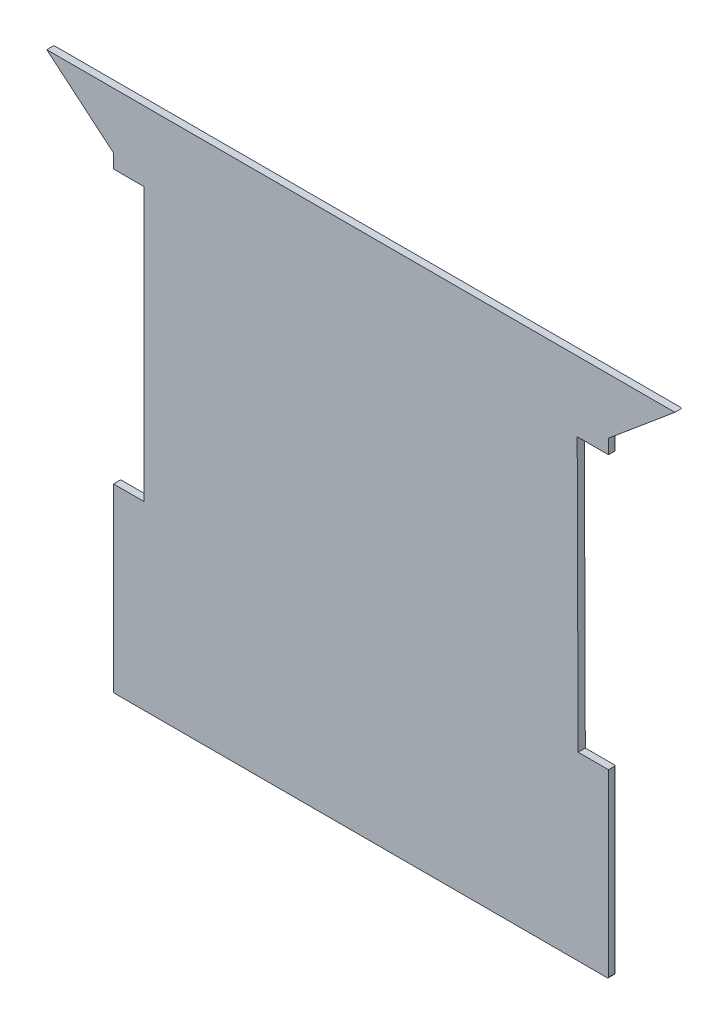
ISO-10303-21;
HEADER;
FILE_DESCRIPTION(('STEP AP214'),'2;1');
FILE_NAME('part.step','',(''),(''),'','','');
FILE_SCHEMA(('AUTOMOTIVE_DESIGN { 1 0 10303 214 1 1 1 1 }'));
ENDSEC;
DATA;
#1=APPLICATION_CONTEXT('core data for automotive mechanical design processes');
#2=APPLICATION_PROTOCOL_DEFINITION('international standard','automotive_design',2000,#1);
#3=PRODUCT_CONTEXT('',#1,'mechanical');
#4=PRODUCT('Part','Part','',(#3));
#5=PRODUCT_RELATED_PRODUCT_CATEGORY('part','',(#4));
#6=PRODUCT_DEFINITION_FORMATION('','',#4);
#7=PRODUCT_DEFINITION_CONTEXT('part definition',#1,'design');
#8=PRODUCT_DEFINITION('design','',#6,#7);
#9=PRODUCT_DEFINITION_SHAPE('','',#8);
#10=(LENGTH_UNIT() NAMED_UNIT(*) SI_UNIT(.MILLI.,.METRE.));
#11=(NAMED_UNIT(*) PLANE_ANGLE_UNIT() SI_UNIT($,.RADIAN.));
#12=(NAMED_UNIT(*) SI_UNIT($,.STERADIAN.) SOLID_ANGLE_UNIT());
#13=UNCERTAINTY_MEASURE_WITH_UNIT(LENGTH_MEASURE(1.E-05),#10,'distance_accuracy_value','');
#14=(GEOMETRIC_REPRESENTATION_CONTEXT(3) GLOBAL_UNCERTAINTY_ASSIGNED_CONTEXT((#13)) GLOBAL_UNIT_ASSIGNED_CONTEXT((#10,
#11,#12)) REPRESENTATION_CONTEXT('',''));
#15=CARTESIAN_POINT('',(0.,0.,0.));
#16=DIRECTION('',(0.,0.,1.));
#17=DIRECTION('',(1.,0.,0.));
#18=AXIS2_PLACEMENT_3D('',#15,#16,#17);
#19=CARTESIAN_POINT('',(326.309589424397,724.438959159954,12.));
#20=DIRECTION('',(0.,1.,0.));
#21=DIRECTION('',(0.,0.,1.));
#22=AXIS2_PLACEMENT_3D('',#19,#20,#21);
#23=PLANE('',#22);
#24=DIRECTION('',(0.,0.,-1.));
#25=VECTOR('',#24,1.);
#26=CARTESIAN_POINT('',(326.309589424397,724.438959159954,12.));
#27=LINE('',#26,#25);
#28=CARTESIAN_POINT('',(326.309589424397,724.438959159954,12.));
#29=VERTEX_POINT('',#28);
#30=CARTESIAN_POINT('',(326.309589424397,724.438959159954,2.));
#31=VERTEX_POINT('',#30);
#32=EDGE_CURVE('E385',#29,#31,#27,.T.);
#33=ORIENTED_EDGE('',*,*,#32,.T.);
#34=CARTESIAN_POINT('',(328.309589424397,724.438959159954,2.));
#35=DIRECTION('',(0.,1.,0.));
#36=DIRECTION('',(0.,0.,1.));
#37=AXIS2_PLACEMENT_3D('',#34,#35,#36);
#38=CIRCLE('',#37,2.);
#39=CARTESIAN_POINT('',(328.309589424397,724.438959159954,0.));
#40=VERTEX_POINT('',#39);
#41=EDGE_CURVE('E268',#31,#40,#38,.F.);
#42=ORIENTED_EDGE('',*,*,#41,.T.);
#43=DIRECTION('',(1.,0.,0.));
#44=VECTOR('',#43,1.);
#45=CARTESIAN_POINT('',(326.309589424397,724.438959159954,0.));
#46=LINE('',#45,#44);
#47=CARTESIAN_POINT('',(377.12760685605,724.438959159954,0.));
#48=VERTEX_POINT('',#47);
#49=EDGE_CURVE('E219',#40,#48,#46,.T.);
#50=ORIENTED_EDGE('',*,*,#49,.T.);
#51=DIRECTION('',(0.,0.,-1.));
#52=VECTOR('',#51,1.);
#53=CARTESIAN_POINT('',(377.12760685605,724.438959159954,12.));
#54=LINE('',#53,#52);
#55=CARTESIAN_POINT('',(377.12760685605,724.438959159954,12.));
#56=VERTEX_POINT('',#55);
#57=EDGE_CURVE('E380',#56,#48,#54,.T.);
#58=ORIENTED_EDGE('',*,*,#57,.F.);
#59=DIRECTION('',(1.,0.,0.));
#60=VECTOR('',#59,1.);
#61=CARTESIAN_POINT('',(326.309589424397,724.438959159954,12.));
#62=LINE('',#61,#60);
#63=EDGE_CURVE('E244',#29,#56,#62,.T.);
#64=ORIENTED_EDGE('',*,*,#63,.F.);
#65=EDGE_LOOP('',(#33,#42,#50,#58,#64));
#66=FACE_BOUND('',#65,.T.);
#67=ADVANCED_FACE('F38',(#66),#23,.F.);
#68=CARTESIAN_POINT('',(377.12760685605,724.438959159954,12.));
#69=DIRECTION('',(1.,0.,0.));
#70=DIRECTION('',(0.,0.,-1.));
#71=AXIS2_PLACEMENT_3D('',#68,#69,#70);
#72=PLANE('',#71);
#73=DIRECTION('',(0.,-1.,0.));
#74=VECTOR('',#73,1.);
#75=CARTESIAN_POINT('',(377.12760685605,724.438959159954,0.));
#76=LINE('',#75,#74);
#77=CARTESIAN_POINT('',(377.12760685605,269.903158483453,0.));
#78=VERTEX_POINT('',#77);
#79=EDGE_CURVE('E217',#48,#78,#76,.T.);
#80=ORIENTED_EDGE('',*,*,#79,.T.);
#81=DIRECTION('',(0.,0.,-1.));
#82=VECTOR('',#81,1.);
#83=CARTESIAN_POINT('',(377.12760685605,269.903158483453,12.));
#84=LINE('',#83,#82);
#85=CARTESIAN_POINT('',(377.12760685605,269.903158483453,12.));
#86=VERTEX_POINT('',#85);
#87=EDGE_CURVE('E376',#86,#78,#84,.T.);
#88=ORIENTED_EDGE('',*,*,#87,.F.);
#89=DIRECTION('',(0.,-1.,0.));
#90=VECTOR('',#89,1.);
#91=CARTESIAN_POINT('',(377.12760685605,724.438959159954,12.));
#92=LINE('',#91,#90);
#93=EDGE_CURVE('E242',#56,#86,#92,.T.);
#94=ORIENTED_EDGE('',*,*,#93,.F.);
#95=ORIENTED_EDGE('',*,*,#57,.T.);
#96=EDGE_LOOP('',(#80,#88,#94,#95));
#97=FACE_BOUND('',#96,.T.);
#98=ADVANCED_FACE('F462',(#97),#72,.F.);
#99=CARTESIAN_POINT('',(377.12760685605,269.903158483453,12.));
#100=DIRECTION('',(0.,-1.,0.));
#101=DIRECTION('',(1.,0.,0.));
#102=AXIS2_PLACEMENT_3D('',#99,#100,#101);
#103=PLANE('',#102);
#104=DIRECTION('',(-1.,0.,0.));
#105=VECTOR('',#104,1.);
#106=CARTESIAN_POINT('',(377.12760685605,269.903158483453,0.));
#107=LINE('',#106,#105);
#108=CARTESIAN_POINT('',(328.309589424397,269.903158483453,0.));
#109=VERTEX_POINT('',#108);
#110=EDGE_CURVE('E214',#78,#109,#107,.T.);
#111=ORIENTED_EDGE('',*,*,#110,.T.);
#112=CARTESIAN_POINT('',(328.309589424397,269.903158483453,2.));
#113=DIRECTION('',(0.,-1.,0.));
#114=DIRECTION('',(1.,0.,0.));
#115=AXIS2_PLACEMENT_3D('',#112,#113,#114);
#116=CIRCLE('',#115,2.);
#117=CARTESIAN_POINT('',(326.309589424397,269.903158483453,2.));
#118=VERTEX_POINT('',#117);
#119=EDGE_CURVE('E309',#109,#118,#116,.F.);
#120=ORIENTED_EDGE('',*,*,#119,.T.);
#121=DIRECTION('',(0.,0.,-1.));
#122=VECTOR('',#121,1.);
#123=CARTESIAN_POINT('',(326.309589424397,269.903158483453,12.));
#124=LINE('',#123,#122);
#125=CARTESIAN_POINT('',(326.309589424397,269.903158483453,12.));
#126=VERTEX_POINT('',#125);
#127=EDGE_CURVE('E379',#126,#118,#124,.T.);
#128=ORIENTED_EDGE('',*,*,#127,.F.);
#129=DIRECTION('',(-1.,0.,0.));
#130=VECTOR('',#129,1.);
#131=CARTESIAN_POINT('',(377.12760685605,269.903158483453,12.));
#132=LINE('',#131,#130);
#133=EDGE_CURVE('E240',#86,#126,#132,.T.);
#134=ORIENTED_EDGE('',*,*,#133,.F.);
#135=ORIENTED_EDGE('',*,*,#87,.T.);
#136=EDGE_LOOP('',(#111,#120,#128,#134,#135));
#137=FACE_BOUND('',#136,.T.);
#138=ADVANCED_FACE('F371',(#137),#103,.F.);
#139=CARTESIAN_POINT('',(326.309589424397,269.903158483453,12.));
#140=DIRECTION('',(1.,0.,0.));
#141=DIRECTION('',(0.,1.,0.));
#142=AXIS2_PLACEMENT_3D('',#139,#140,#141);
#143=PLANE('',#142);
#144=DIRECTION('',(0.,-1.,0.));
#145=VECTOR('',#144,1.);
#146=CARTESIAN_POINT('',(326.309589424397,269.903158483453,2.));
#147=LINE('',#146,#145);
#148=CARTESIAN_POINT('',(326.309589424397,-29.4460095883093,2.));
#149=VERTEX_POINT('',#148);
#150=EDGE_CURVE('E298',#118,#149,#147,.T.);
#151=ORIENTED_EDGE('',*,*,#150,.T.);
#152=DIRECTION('',(0.,0.,-1.));
#153=VECTOR('',#152,1.);
#154=CARTESIAN_POINT('',(326.309589424397,-29.4460095883093,12.));
#155=LINE('',#154,#153);
#156=CARTESIAN_POINT('',(326.309589424397,-29.4460095883093,12.));
#157=VERTEX_POINT('',#156);
#158=EDGE_CURVE('E300',#149,#157,#155,.F.);
#159=ORIENTED_EDGE('',*,*,#158,.T.);
#160=DIRECTION('',(0.,-1.,0.));
#161=VECTOR('',#160,1.);
#162=CARTESIAN_POINT('',(326.309589424397,269.903158483453,12.));
#163=LINE('',#162,#161);
#164=EDGE_CURVE('E237',#126,#157,#163,.T.);
#165=ORIENTED_EDGE('',*,*,#164,.F.);
#166=ORIENTED_EDGE('',*,*,#127,.T.);
#167=EDGE_LOOP('',(#151,#159,#165,#166));
#168=FACE_BOUND('',#167,.T.);
#169=ADVANCED_FACE('F467',(#168),#143,.F.);
#170=CARTESIAN_POINT('',(326.309589424397,-31.4460095883093,12.));
#171=DIRECTION('',(0.,1.,0.));
#172=DIRECTION('',(0.,0.,1.));
#173=AXIS2_PLACEMENT_3D('',#170,#171,#172);
#174=PLANE('',#173);
#175=DIRECTION('',(1.,0.,0.));
#176=VECTOR('',#175,1.);
#177=CARTESIAN_POINT('',(326.309589424397,-31.4460095883093,2.));
#178=LINE('',#177,#176);
#179=CARTESIAN_POINT('',(328.309589424397,-31.4460095883093,2.));
#180=VERTEX_POINT('',#179);
#181=CARTESIAN_POINT('',(1149.3095894244,-31.4460095883093,2.));
#182=VERTEX_POINT('',#181);
#183=EDGE_CURVE('E270',#180,#182,#178,.T.);
#184=ORIENTED_EDGE('',*,*,#183,.T.);
#185=DIRECTION('',(0.,0.,-1.));
#186=VECTOR('',#185,1.);
#187=CARTESIAN_POINT('',(1149.3095894244,-31.4460095883093,12.));
#188=LINE('',#187,#186);
#189=CARTESIAN_POINT('',(1149.3095894244,-31.4460095883093,12.));
#190=VERTEX_POINT('',#189);
#191=EDGE_CURVE('E320',#182,#190,#188,.F.);
#192=ORIENTED_EDGE('',*,*,#191,.T.);
#193=DIRECTION('',(1.,0.,0.));
#194=VECTOR('',#193,1.);
#195=CARTESIAN_POINT('',(326.309589424397,-31.4460095883093,12.));
#196=LINE('',#195,#194);
#197=CARTESIAN_POINT('',(328.309589424397,-31.4460095883093,12.));
#198=VERTEX_POINT('',#197);
#199=EDGE_CURVE('E234',#198,#190,#196,.T.);
#200=ORIENTED_EDGE('',*,*,#199,.F.);
#201=DIRECTION('',(0.,0.,-1.));
#202=VECTOR('',#201,1.);
#203=CARTESIAN_POINT('',(328.309589424397,-31.4460095883093,12.));
#204=LINE('',#203,#202);
#205=EDGE_CURVE('E295',#198,#180,#204,.T.);
#206=ORIENTED_EDGE('',*,*,#205,.T.);
#207=EDGE_LOOP('',(#184,#192,#200,#206));
#208=FACE_BOUND('',#207,.T.);
#209=ADVANCED_FACE('F350',(#208),#174,.F.);
#210=CARTESIAN_POINT('',(1151.3095894244,269.903158483453,12.));
#211=DIRECTION('',(-1.,0.,0.));
#212=DIRECTION('',(0.,0.,1.));
#213=AXIS2_PLACEMENT_3D('',#210,#211,#212);
#214=PLANE('',#213);
#215=DIRECTION('',(0.,1.,0.));
#216=VECTOR('',#215,1.);
#217=CARTESIAN_POINT('',(1151.3095894244,269.903158483453,12.));
#218=LINE('',#217,#216);
#219=CARTESIAN_POINT('',(1151.3095894244,-29.4460095883093,12.));
#220=VERTEX_POINT('',#219);
#221=CARTESIAN_POINT('',(1151.3095894244,269.903158483453,12.));
#222=VERTEX_POINT('',#221);
#223=EDGE_CURVE('E232',#220,#222,#218,.T.);
#224=ORIENTED_EDGE('',*,*,#223,.F.);
#225=DIRECTION('',(0.,0.,-1.));
#226=VECTOR('',#225,1.);
#227=CARTESIAN_POINT('',(1151.3095894244,-29.4460095883093,12.));
#228=LINE('',#227,#226);
#229=CARTESIAN_POINT('',(1151.3095894244,-29.4460095883093,2.));
#230=VERTEX_POINT('',#229);
#231=EDGE_CURVE('E317',#220,#230,#228,.T.);
#232=ORIENTED_EDGE('',*,*,#231,.T.);
#233=DIRECTION('',(0.,1.,0.));
#234=VECTOR('',#233,1.);
#235=CARTESIAN_POINT('',(1151.3095894244,269.903158483453,2.));
#236=LINE('',#235,#234);
#237=CARTESIAN_POINT('',(1151.3095894244,269.903158483453,2.));
#238=VERTEX_POINT('',#237);
#239=EDGE_CURVE('E311',#230,#238,#236,.T.);
#240=ORIENTED_EDGE('',*,*,#239,.T.);
#241=DIRECTION('',(0.,0.,-1.));
#242=VECTOR('',#241,1.);
#243=CARTESIAN_POINT('',(1151.3095894244,269.903158483453,12.));
#244=LINE('',#243,#242);
#245=EDGE_CURVE('E382',#222,#238,#244,.T.);
#246=ORIENTED_EDGE('',*,*,#245,.F.);
#247=EDGE_LOOP('',(#224,#232,#240,#246));
#248=FACE_BOUND('',#247,.T.);
#249=ADVANCED_FACE('F341',(#248),#214,.F.);
#250=CARTESIAN_POINT('',(1151.3095894244,269.903158483453,12.));
#251=DIRECTION('',(0.,-1.,0.));
#252=DIRECTION('',(0.,0.,-1.));
#253=AXIS2_PLACEMENT_3D('',#250,#251,#252);
#254=PLANE('',#253);
#255=ORIENTED_EDGE('',*,*,#245,.T.);
#256=CARTESIAN_POINT('',(1149.3095894244,269.903158483453,2.));
#257=DIRECTION('',(0.,-1.,0.));
#258=DIRECTION('',(0.,0.,-1.));
#259=AXIS2_PLACEMENT_3D('',#256,#257,#258);
#260=CIRCLE('',#259,2.);
#261=CARTESIAN_POINT('',(1149.3095894244,269.903158483453,0.));
#262=VERTEX_POINT('',#261);
#263=EDGE_CURVE('E47',#238,#262,#260,.F.);
#264=ORIENTED_EDGE('',*,*,#263,.T.);
#265=DIRECTION('',(-1.,0.,0.));
#266=VECTOR('',#265,1.);
#267=CARTESIAN_POINT('',(1151.3095894244,269.903158483453,0.));
#268=LINE('',#267,#266);
#269=CARTESIAN_POINT('',(1100.60496026136,269.903158483453,0.));
#270=VERTEX_POINT('',#269);
#271=EDGE_CURVE('E191',#262,#270,#268,.T.);
#272=ORIENTED_EDGE('',*,*,#271,.T.);
#273=DIRECTION('',(0.,0.,-1.));
#274=VECTOR('',#273,1.);
#275=CARTESIAN_POINT('',(1100.60496026136,269.903158483453,12.));
#276=LINE('',#275,#274);
#277=CARTESIAN_POINT('',(1100.60496026136,269.903158483453,12.));
#278=VERTEX_POINT('',#277);
#279=EDGE_CURVE('E189',#278,#270,#276,.T.);
#280=ORIENTED_EDGE('',*,*,#279,.F.);
#281=DIRECTION('',(-1.,0.,0.));
#282=VECTOR('',#281,1.);
#283=CARTESIAN_POINT('',(1151.3095894244,269.903158483453,12.));
#284=LINE('',#283,#282);
#285=EDGE_CURVE('E230',#222,#278,#284,.T.);
#286=ORIENTED_EDGE('',*,*,#285,.F.);
#287=EDGE_LOOP('',(#255,#264,#272,#280,#286));
#288=FACE_BOUND('',#287,.T.);
#289=ADVANCED_FACE('F475',(#288),#254,.F.);
#290=CARTESIAN_POINT('',(1100.60496026136,269.903158483453,12.));
#291=DIRECTION('',(-0.999994410080062,-0.00334362208223662,0.));
#292=DIRECTION('',(0.00334362208223662,-0.999994410080062,0.));
#293=AXIS2_PLACEMENT_3D('',#290,#291,#292);
#294=PLANE('',#293);
#295=DIRECTION('',(-0.00334362208223662,0.999994410080062,0.));
#296=VECTOR('',#295,1.);
#297=CARTESIAN_POINT('',(1100.60496026136,269.903158483453,0.));
#298=LINE('',#297,#296);
#299=CARTESIAN_POINT('',(1099.08515582547,724.438959159954,0.));
#300=VERTEX_POINT('',#299);
#301=EDGE_CURVE('E182',#270,#300,#298,.T.);
#302=ORIENTED_EDGE('',*,*,#301,.T.);
#303=DIRECTION('',(0.,0.,-1.));
#304=VECTOR('',#303,1.);
#305=CARTESIAN_POINT('',(1099.08515582547,724.438959159954,12.));
#306=LINE('',#305,#304);
#307=CARTESIAN_POINT('',(1099.08515582547,724.438959159954,12.));
#308=VERTEX_POINT('',#307);
#309=EDGE_CURVE('E186',#308,#300,#306,.T.);
#310=ORIENTED_EDGE('',*,*,#309,.F.);
#311=DIRECTION('',(-0.00334362208223662,0.999994410080062,0.));
#312=VECTOR('',#311,1.);
#313=CARTESIAN_POINT('',(1100.60496026136,269.903158483453,12.));
#314=LINE('',#313,#312);
#315=EDGE_CURVE('E228',#278,#308,#314,.T.);
#316=ORIENTED_EDGE('',*,*,#315,.F.);
#317=ORIENTED_EDGE('',*,*,#279,.T.);
#318=EDGE_LOOP('',(#302,#310,#316,#317));
#319=FACE_BOUND('',#318,.T.);
#320=ADVANCED_FACE('F184',(#319),#294,.F.);
#321=CARTESIAN_POINT('',(1099.08515582547,724.438959159954,12.));
#322=DIRECTION('',(0.,1.,0.));
#323=DIRECTION('',(0.,0.,1.));
#324=AXIS2_PLACEMENT_3D('',#321,#322,#323);
#325=PLANE('',#324);
#326=DIRECTION('',(1.,0.,0.));
#327=VECTOR('',#326,1.);
#328=CARTESIAN_POINT('',(1099.08515582547,724.438959159954,0.));
#329=LINE('',#328,#327);
#330=CARTESIAN_POINT('',(1149.3095894244,724.438959159954,0.));
#331=VERTEX_POINT('',#330);
#332=EDGE_CURVE('E192',#300,#331,#329,.T.);
#333=ORIENTED_EDGE('',*,*,#332,.T.);
#334=CARTESIAN_POINT('',(1149.3095894244,724.438959159954,2.));
#335=DIRECTION('',(0.,1.,0.));
#336=DIRECTION('',(0.,0.,1.));
#337=AXIS2_PLACEMENT_3D('',#334,#335,#336);
#338=CIRCLE('',#337,2.);
#339=CARTESIAN_POINT('',(1151.3095894244,724.438959159954,2.));
#340=VERTEX_POINT('',#339);
#341=EDGE_CURVE('E290',#331,#340,#338,.F.);
#342=ORIENTED_EDGE('',*,*,#341,.T.);
#343=DIRECTION('',(0.,0.,-1.));
#344=VECTOR('',#343,1.);
#345=CARTESIAN_POINT('',(1151.3095894244,724.438959159954,12.));
#346=LINE('',#345,#344);
#347=CARTESIAN_POINT('',(1151.3095894244,724.438959159954,12.));
#348=VERTEX_POINT('',#347);
#349=EDGE_CURVE('E200',#348,#340,#346,.T.);
#350=ORIENTED_EDGE('',*,*,#349,.F.);
#351=DIRECTION('',(1.,0.,0.));
#352=VECTOR('',#351,1.);
#353=CARTESIAN_POINT('',(1099.08515582547,724.438959159954,12.));
#354=LINE('',#353,#352);
#355=EDGE_CURVE('E199',#308,#348,#354,.T.);
#356=ORIENTED_EDGE('',*,*,#355,.F.);
#357=ORIENTED_EDGE('',*,*,#309,.T.);
#358=EDGE_LOOP('',(#333,#342,#350,#356,#357));
#359=FACE_BOUND('',#358,.T.);
#360=ADVANCED_FACE('F196',(#359),#325,.F.);
#361=CARTESIAN_POINT('',(326.309589424397,747.700936122895,12.));
#362=DIRECTION('',(1.,0.,0.));
#363=DIRECTION('',(0.,0.,-1.));
#364=AXIS2_PLACEMENT_3D('',#361,#362,#363);
#365=PLANE('',#364);
#366=DIRECTION('',(0.,0.,-1.));
#367=VECTOR('',#366,1.);
#368=CARTESIAN_POINT('',(326.309589424397,747.700936122895,12.));
#369=LINE('',#368,#367);
#370=CARTESIAN_POINT('',(326.309589424397,747.700936122895,12.));
#371=VERTEX_POINT('',#370);
#372=CARTESIAN_POINT('',(326.309589424397,747.700936122895,2.));
#373=VERTEX_POINT('',#372);
#374=EDGE_CURVE('E273',#371,#373,#369,.T.);
#375=ORIENTED_EDGE('',*,*,#374,.T.);
#376=DIRECTION('',(0.,-1.,0.));
#377=VECTOR('',#376,1.);
#378=CARTESIAN_POINT('',(326.309589424397,747.700936122895,2.));
#379=LINE('',#378,#377);
#380=EDGE_CURVE('E266',#373,#31,#379,.T.);
#381=ORIENTED_EDGE('',*,*,#380,.T.);
#382=ORIENTED_EDGE('',*,*,#32,.F.);
#383=DIRECTION('',(0.,-1.,0.));
#384=VECTOR('',#383,1.);
#385=CARTESIAN_POINT('',(326.309589424397,747.700936122895,12.));
#386=LINE('',#385,#384);
#387=EDGE_CURVE('E207',#371,#29,#386,.T.);
#388=ORIENTED_EDGE('',*,*,#387,.F.);
#389=EDGE_LOOP('',(#375,#381,#382,#388));
#390=FACE_BOUND('',#389,.T.);
#391=ADVANCED_FACE('F428',(#390),#365,.F.);
#392=CARTESIAN_POINT('',(1151.3095894244,748.491751264202,12.));
#393=DIRECTION('',(-1.,0.,0.));
#394=DIRECTION('',(0.,-1.,0.));
#395=AXIS2_PLACEMENT_3D('',#392,#393,#394);
#396=PLANE('',#395);
#397=ORIENTED_EDGE('',*,*,#349,.T.);
#398=DIRECTION('',(0.,1.,0.));
#399=VECTOR('',#398,1.);
#400=CARTESIAN_POINT('',(1151.3095894244,748.491751264202,2.));
#401=LINE('',#400,#399);
#402=CARTESIAN_POINT('',(1151.3095894244,748.491751264202,2.));
#403=VERTEX_POINT('',#402);
#404=EDGE_CURVE('E286',#340,#403,#401,.T.);
#405=ORIENTED_EDGE('',*,*,#404,.T.);
#406=DIRECTION('',(0.,0.,-1.));
#407=VECTOR('',#406,1.);
#408=CARTESIAN_POINT('',(1151.3095894244,748.491751264202,12.));
#409=LINE('',#408,#407);
#410=CARTESIAN_POINT('',(1151.3095894244,748.491751264202,12.));
#411=VERTEX_POINT('',#410);
#412=EDGE_CURVE('E210',#411,#403,#409,.T.);
#413=ORIENTED_EDGE('',*,*,#412,.F.);
#414=DIRECTION('',(0.,1.,0.));
#415=VECTOR('',#414,1.);
#416=CARTESIAN_POINT('',(1151.3095894244,748.491751264202,12.));
#417=LINE('',#416,#415);
#418=EDGE_CURVE('E225',#348,#411,#417,.T.);
#419=ORIENTED_EDGE('',*,*,#418,.F.);
#420=EDGE_LOOP('',(#397,#405,#413,#419));
#421=FACE_BOUND('',#420,.T.);
#422=ADVANCED_FACE('F434',(#421),#396,.F.);
#423=CARTESIAN_POINT('',(0.,0.,12.));
#424=DIRECTION('',(0.,0.,1.));
#425=DIRECTION('',(1.,0.,0.));
#426=AXIS2_PLACEMENT_3D('',#423,#424,#425);
#427=PLANE('',#426);
#428=ORIENTED_EDGE('',*,*,#199,.T.);
#429=CARTESIAN_POINT('',(1149.3095894244,-29.4460095883093,12.));
#430=DIRECTION('',(0.,0.,1.));
#431=DIRECTION('',(1.,0.,0.));
#432=AXIS2_PLACEMENT_3D('',#429,#430,#431);
#433=CIRCLE('',#432,2.);
#434=EDGE_CURVE('E322',#190,#220,#433,.T.);
#435=ORIENTED_EDGE('',*,*,#434,.T.);
#436=ORIENTED_EDGE('',*,*,#223,.T.);
#437=ORIENTED_EDGE('',*,*,#285,.T.);
#438=ORIENTED_EDGE('',*,*,#315,.T.);
#439=ORIENTED_EDGE('',*,*,#355,.T.);
#440=ORIENTED_EDGE('',*,*,#418,.T.);
#441=DIRECTION('',(0.766948152896775,0.641709070193203,0.));
#442=VECTOR('',#441,1.);
#443=CARTESIAN_POINT('',(1151.3095894244,748.491751264202,12.));
#444=LINE('',#443,#442);
#445=CARTESIAN_POINT('',(1261.9367281695,841.053990411817,12.));
#446=VERTEX_POINT('',#445);
#447=EDGE_CURVE('E222',#411,#446,#444,.T.);
#448=ORIENTED_EDGE('',*,*,#447,.T.);
#449=DIRECTION('',(1.,0.,0.));
#450=VECTOR('',#449,1.);
#451=CARTESIAN_POINT('',(-6.11684115650869E-13,841.053990411816,12.));
#452=LINE('',#451,#450);
#453=CARTESIAN_POINT('',(215.065202413403,841.053990411817,12.));
#454=VERTEX_POINT('',#453);
#455=EDGE_CURVE('E252',#454,#446,#452,.T.);
#456=ORIENTED_EDGE('',*,*,#455,.F.);
#457=DIRECTION('',(0.766017554047301,-0.642819653473189,0.));
#458=VECTOR('',#457,1.);
#459=CARTESIAN_POINT('',(326.309589424397,747.700936122895,12.));
#460=LINE('',#459,#458);
#461=EDGE_CURVE('E205',#454,#371,#460,.T.);
#462=ORIENTED_EDGE('',*,*,#461,.T.);
#463=ORIENTED_EDGE('',*,*,#387,.T.);
#464=ORIENTED_EDGE('',*,*,#63,.T.);
#465=ORIENTED_EDGE('',*,*,#93,.T.);
#466=ORIENTED_EDGE('',*,*,#133,.T.);
#467=ORIENTED_EDGE('',*,*,#164,.T.);
#468=CARTESIAN_POINT('',(328.309589424397,-29.4460095883093,12.));
#469=DIRECTION('',(0.,0.,1.));
#470=DIRECTION('',(1.,0.,0.));
#471=AXIS2_PLACEMENT_3D('',#468,#469,#470);
#472=CIRCLE('',#471,2.);
#473=EDGE_CURVE('E302',#157,#198,#472,.T.);
#474=ORIENTED_EDGE('',*,*,#473,.T.);
#475=EDGE_LOOP('',(#428,#435,#436,#437,#438,#439,#440,#448,#456,#462,#463,#464,#465,#466,#467,#474));
#476=FACE_BOUND('',#475,.T.);
#477=ADVANCED_FACE('F345',(#476),#427,.T.);
#478=CARTESIAN_POINT('',(0.,0.,0.));
#479=DIRECTION('',(0.,0.,1.));
#480=DIRECTION('',(1.,0.,0.));
#481=AXIS2_PLACEMENT_3D('',#478,#479,#480);
#482=PLANE('',#481);
#483=ORIENTED_EDGE('',*,*,#271,.F.);
#484=DIRECTION('',(0.,1.,0.));
#485=VECTOR('',#484,1.);
#486=CARTESIAN_POINT('',(1149.3095894244,0.,0.));
#487=LINE('',#486,#485);
#488=CARTESIAN_POINT('',(1149.3095894244,-29.4460095883093,0.));
#489=VERTEX_POINT('',#488);
#490=EDGE_CURVE('E11',#262,#489,#487,.F.);
#491=ORIENTED_EDGE('',*,*,#490,.T.);
#492=DIRECTION('',(1.,0.,0.));
#493=VECTOR('',#492,1.);
#494=CARTESIAN_POINT('',(0.,-29.4460095883093,0.));
#495=LINE('',#494,#493);
#496=CARTESIAN_POINT('',(328.309589424397,-29.4460095883093,0.));
#497=VERTEX_POINT('',#496);
#498=EDGE_CURVE('E277',#489,#497,#495,.F.);
#499=ORIENTED_EDGE('',*,*,#498,.T.);
#500=DIRECTION('',(0.,-1.,0.));
#501=VECTOR('',#500,1.);
#502=CARTESIAN_POINT('',(328.309589424397,0.,0.));
#503=LINE('',#502,#501);
#504=EDGE_CURVE('E307',#497,#109,#503,.F.);
#505=ORIENTED_EDGE('',*,*,#504,.T.);
#506=ORIENTED_EDGE('',*,*,#110,.F.);
#507=ORIENTED_EDGE('',*,*,#79,.F.);
#508=ORIENTED_EDGE('',*,*,#49,.F.);
#509=DIRECTION('',(0.,-1.,0.));
#510=VECTOR('',#509,1.);
#511=CARTESIAN_POINT('',(328.309589424397,0.,0.));
#512=LINE('',#511,#510);
#513=CARTESIAN_POINT('',(328.309589424397,748.63350051294,0.));
#514=VERTEX_POINT('',#513);
#515=EDGE_CURVE('E260',#40,#514,#512,.F.);
#516=ORIENTED_EDGE('',*,*,#515,.T.);
#517=DIRECTION('',(0.766017554047301,-0.642819653473189,0.));
#518=VECTOR('',#517,1.);
#519=CARTESIAN_POINT('',(504.298613123565,600.948630066227,0.));
#520=LINE('',#519,#518);
#521=CARTESIAN_POINT('',(218.176494965201,841.053990411816,0.));
#522=VERTEX_POINT('',#521);
#523=EDGE_CURVE('E262',#514,#522,#520,.F.);
#524=ORIENTED_EDGE('',*,*,#523,.T.);
#525=DIRECTION('',(1.,0.,0.));
#526=VECTOR('',#525,1.);
#527=CARTESIAN_POINT('',(-6.11684115650869E-13,841.053990411816,0.));
#528=LINE('',#527,#526);
#529=CARTESIAN_POINT('',(1258.82005101329,841.053990411817,0.));
#530=VERTEX_POINT('',#529);
#531=EDGE_CURVE('E249',#522,#530,#528,.T.);
#532=ORIENTED_EDGE('',*,*,#531,.T.);
#533=DIRECTION('',(0.766948152896775,0.641709070193203,0.));
#534=VECTOR('',#533,1.);
#535=CARTESIAN_POINT('',(104.439075262917,-124.82191632265,0.));
#536=LINE('',#535,#534);
#537=CARTESIAN_POINT('',(1149.3095894244,749.426080210568,0.));
#538=VERTEX_POINT('',#537);
#539=EDGE_CURVE('E284',#530,#538,#536,.F.);
#540=ORIENTED_EDGE('',*,*,#539,.T.);
#541=DIRECTION('',(0.,1.,0.));
#542=VECTOR('',#541,1.);
#543=CARTESIAN_POINT('',(1149.30958942442,3.18297342712942E-11,0.));
#544=LINE('',#543,#542);
#545=EDGE_CURVE('E204',#538,#331,#544,.F.);
#546=ORIENTED_EDGE('',*,*,#545,.T.);
#547=ORIENTED_EDGE('',*,*,#332,.F.);
#548=ORIENTED_EDGE('',*,*,#301,.F.);
#549=EDGE_LOOP('',(#483,#491,#499,#505,#506,#507,#508,#516,#524,#532,#540,#546,#547,#548));
#550=FACE_BOUND('',#549,.T.);
#551=ADVANCED_FACE('F202',(#550),#482,.F.);
#552=CARTESIAN_POINT('',(1151.3095894244,748.491751264202,12.));
#553=DIRECTION('',(-0.641709070193203,0.766948152896774,0.));
#554=DIRECTION('',(-0.766948152896775,-0.641709070193203,0.));
#555=AXIS2_PLACEMENT_3D('',#552,#553,#554);
#556=PLANE('',#555);
#557=ORIENTED_EDGE('',*,*,#412,.T.);
#558=DIRECTION('',(0.766948152896775,0.641709070193203,0.));
#559=VECTOR('',#558,1.);
#560=CARTESIAN_POINT('',(1151.3095894244,748.491751264202,2.));
#561=LINE('',#560,#559);
#562=CARTESIAN_POINT('',(1261.9367281695,841.053990411817,2.));
#563=VERTEX_POINT('',#562);
#564=EDGE_CURVE('E279',#403,#563,#561,.T.);
#565=ORIENTED_EDGE('',*,*,#564,.T.);
#566=DIRECTION('',(0.,0.,1.));
#567=VECTOR('',#566,1.);
#568=CARTESIAN_POINT('',(1261.9367281695,841.053990411817,11.9999999999993));
#569=LINE('',#568,#567);
#570=EDGE_CURVE('E221',#563,#446,#569,.T.);
#571=ORIENTED_EDGE('',*,*,#570,.T.);
#572=ORIENTED_EDGE('',*,*,#447,.F.);
#573=EDGE_LOOP('',(#557,#565,#571,#572));
#574=FACE_BOUND('',#573,.T.);
#575=ADVANCED_FACE('F399',(#574),#556,.F.);
#576=CARTESIAN_POINT('',(326.309589424397,747.700936122895,12.));
#577=DIRECTION('',(0.642819653473188,0.766017554047301,0.));
#578=DIRECTION('',(-0.766017554047301,0.642819653473189,0.));
#579=AXIS2_PLACEMENT_3D('',#576,#577,#578);
#580=PLANE('',#579);
#581=DIRECTION('',(0.,0.,-1.));
#582=VECTOR('',#581,1.);
#583=CARTESIAN_POINT('',(215.065202413403,841.053990411817,11.9999999999993));
#584=LINE('',#583,#582);
#585=CARTESIAN_POINT('',(215.065202413404,841.053990411817,2.));
#586=VERTEX_POINT('',#585);
#587=EDGE_CURVE('E248',#454,#586,#584,.T.);
#588=ORIENTED_EDGE('',*,*,#587,.T.);
#589=DIRECTION('',(0.766017554047301,-0.642819653473189,0.));
#590=VECTOR('',#589,1.);
#591=CARTESIAN_POINT('',(326.309589424397,747.700936122895,2.));
#592=LINE('',#591,#590);
#593=EDGE_CURVE('E255',#586,#373,#592,.T.);
#594=ORIENTED_EDGE('',*,*,#593,.T.);
#595=ORIENTED_EDGE('',*,*,#374,.F.);
#596=ORIENTED_EDGE('',*,*,#461,.F.);
#597=EDGE_LOOP('',(#588,#594,#595,#596));
#598=FACE_BOUND('',#597,.T.);
#599=ADVANCED_FACE('F425',(#598),#580,.F.);
#600=CARTESIAN_POINT('',(328.309589424397,747.700936122895,2.));
#601=DIRECTION('',(0.,-1.,0.));
#602=DIRECTION('',(0.,0.,-1.));
#603=AXIS2_PLACEMENT_3D('',#600,#601,#602);
#604=CYLINDRICAL_SURFACE('',#603,2.);
#605=ORIENTED_EDGE('',*,*,#41,.F.);
#606=ORIENTED_EDGE('',*,*,#380,.F.);
#607=CARTESIAN_POINT('',(328.309589424397,748.63350051294,2.));
#608=DIRECTION('',(0.422599305800904,-0.906316626095204,0.));
#609=DIRECTION('',(0.906316626095204,0.422599305800904,0.));
#610=AXIS2_PLACEMENT_3D('',#607,#608,#609);
#611=ELLIPSE('',#610,2.20673431603792,2.);
#612=EDGE_CURVE('E271',#514,#373,#611,.F.);
#613=ORIENTED_EDGE('',*,*,#612,.F.);
#614=ORIENTED_EDGE('',*,*,#515,.F.);
#615=EDGE_LOOP('',(#605,#606,#613,#614));
#616=FACE_BOUND('',#615,.T.);
#617=ADVANCED_FACE('F418',(#616),#604,.T.);
#618=CARTESIAN_POINT('',(327.595228731344,749.23297123099,2.));
#619=DIRECTION('',(0.766017554047301,-0.642819653473189,0.));
#620=DIRECTION('',(0.642819653473189,0.766017554047301,0.));
#621=AXIS2_PLACEMENT_3D('',#618,#619,#620);
#622=CYLINDRICAL_SURFACE('',#621,2.);
#623=CARTESIAN_POINT('',(218.176494965201,841.053990411816,2.));
#624=DIRECTION('',(0.,-1.,0.));
#625=DIRECTION('',(1.,0.,0.));
#626=AXIS2_PLACEMENT_3D('',#623,#624,#625);
#627=ELLIPSE('',#626,3.11129255179722,2.);
#628=EDGE_CURVE('E264',#522,#586,#627,.F.);
#629=ORIENTED_EDGE('',*,*,#628,.F.);
#630=ORIENTED_EDGE('',*,*,#523,.F.);
#631=ORIENTED_EDGE('',*,*,#612,.T.);
#632=ORIENTED_EDGE('',*,*,#593,.F.);
#633=EDGE_LOOP('',(#629,#630,#631,#632));
#634=FACE_BOUND('',#633,.T.);
#635=ADVANCED_FACE('F413',(#634),#622,.T.);
#636=CARTESIAN_POINT('',(326.309589424397,-29.4460095883093,2.));
#637=DIRECTION('',(1.,0.,0.));
#638=DIRECTION('',(0.,0.,-1.));
#639=AXIS2_PLACEMENT_3D('',#636,#637,#638);
#640=CYLINDRICAL_SURFACE('',#639,2.);
#641=ORIENTED_EDGE('',*,*,#498,.F.);
#642=CARTESIAN_POINT('',(1149.3095894244,-29.4460095883093,2.));
#643=DIRECTION('',(1.,0.,0.));
#644=DIRECTION('',(0.,0.,-1.));
#645=AXIS2_PLACEMENT_3D('',#642,#643,#644);
#646=CIRCLE('',#645,2.);
#647=EDGE_CURVE('E324',#489,#182,#646,.F.);
#648=ORIENTED_EDGE('',*,*,#647,.T.);
#649=ORIENTED_EDGE('',*,*,#183,.F.);
#650=CARTESIAN_POINT('',(328.309589424397,-29.4460095883093,2.));
#651=DIRECTION('',(1.,0.,0.));
#652=DIRECTION('',(0.,0.,-1.));
#653=AXIS2_PLACEMENT_3D('',#650,#651,#652);
#654=CIRCLE('',#653,2.);
#655=EDGE_CURVE('E304',#180,#497,#654,.T.);
#656=ORIENTED_EDGE('',*,*,#655,.T.);
#657=EDGE_LOOP('',(#641,#648,#649,#656));
#658=FACE_BOUND('',#657,.T.);
#659=ADVANCED_FACE('F362',(#658),#640,.T.);
#660=CARTESIAN_POINT('',(1150.02617128401,750.025647569995,2.));
#661=DIRECTION('',(0.766948152896775,0.641709070193203,0.));
#662=DIRECTION('',(-0.641709070193203,0.766948152896775,0.));
#663=AXIS2_PLACEMENT_3D('',#660,#661,#662);
#664=CYLINDRICAL_SURFACE('',#663,2.);
#665=ORIENTED_EDGE('',*,*,#564,.F.);
#666=CARTESIAN_POINT('',(1149.3095894244,749.426080210568,2.));
#667=DIRECTION('',(0.423255791340636,0.906010229024271,0.));
#668=DIRECTION('',(-0.906010229024271,0.423255791340636,0.));
#669=AXIS2_PLACEMENT_3D('',#666,#667,#668);
#670=ELLIPSE('',#669,2.20748059561527,2.);
#671=EDGE_CURVE('E292',#403,#538,#670,.T.);
#672=ORIENTED_EDGE('',*,*,#671,.T.);
#673=ORIENTED_EDGE('',*,*,#539,.F.);
#674=CARTESIAN_POINT('',(1258.82005101329,841.053990411817,2.));
#675=DIRECTION('',(0.,-1.,0.));
#676=DIRECTION('',(1.,0.,0.));
#677=AXIS2_PLACEMENT_3D('',#674,#675,#676);
#678=ELLIPSE('',#677,3.1166771562039,2.);
#679=EDGE_CURVE('E282',#563,#530,#678,.F.);
#680=ORIENTED_EDGE('',*,*,#679,.F.);
#681=EDGE_LOOP('',(#665,#672,#673,#680));
#682=FACE_BOUND('',#681,.T.);
#683=ADVANCED_FACE('F402',(#682),#664,.T.);
#684=CARTESIAN_POINT('',(1149.3095894244,748.491751264202,2.));
#685=DIRECTION('',(0.,1.,0.));
#686=DIRECTION('',(-1.,0.,0.));
#687=AXIS2_PLACEMENT_3D('',#684,#685,#686);
#688=CYLINDRICAL_SURFACE('',#687,2.);
#689=ORIENTED_EDGE('',*,*,#341,.F.);
#690=ORIENTED_EDGE('',*,*,#545,.F.);
#691=ORIENTED_EDGE('',*,*,#671,.F.);
#692=ORIENTED_EDGE('',*,*,#404,.F.);
#693=EDGE_LOOP('',(#689,#690,#691,#692));
#694=FACE_BOUND('',#693,.T.);
#695=ADVANCED_FACE('F548',(#694),#688,.T.);
#696=CARTESIAN_POINT('',(328.309589424397,269.903158483453,2.));
#697=DIRECTION('',(0.,-1.,0.));
#698=DIRECTION('',(1.,0.,0.));
#699=AXIS2_PLACEMENT_3D('',#696,#697,#698);
#700=CYLINDRICAL_SURFACE('',#699,2.);
#701=ORIENTED_EDGE('',*,*,#119,.F.);
#702=ORIENTED_EDGE('',*,*,#504,.F.);
#703=CARTESIAN_POINT('',(328.309589424397,-29.4460095883093,2.));
#704=DIRECTION('',(0.,-1.,0.));
#705=DIRECTION('',(0.,0.,-1.));
#706=AXIS2_PLACEMENT_3D('',#703,#704,#705);
#707=CIRCLE('',#706,2.);
#708=EDGE_CURVE('E274',#149,#497,#707,.T.);
#709=ORIENTED_EDGE('',*,*,#708,.F.);
#710=ORIENTED_EDGE('',*,*,#150,.F.);
#711=EDGE_LOOP('',(#701,#702,#709,#710));
#712=FACE_BOUND('',#711,.T.);
#713=ADVANCED_FACE('F365',(#712),#700,.T.);
#714=CARTESIAN_POINT('',(328.309589424397,-29.4460095883093,2.));
#715=DIRECTION('',(1.,0.,0.));
#716=DIRECTION('',(0.,1.,0.));
#717=AXIS2_PLACEMENT_3D('',#714,#715,#716);
#718=SPHERICAL_SURFACE('',#717,2.);
#719=ORIENTED_EDGE('',*,*,#708,.T.);
#720=ORIENTED_EDGE('',*,*,#655,.F.);
#721=CARTESIAN_POINT('',(328.309589424397,-29.4460095883093,2.));
#722=DIRECTION('',(0.,0.,1.));
#723=DIRECTION('',(1.,0.,0.));
#724=AXIS2_PLACEMENT_3D('',#721,#722,#723);
#725=CIRCLE('',#724,2.);
#726=EDGE_CURVE('E312',#149,#180,#725,.T.);
#727=ORIENTED_EDGE('',*,*,#726,.F.);
#728=EDGE_LOOP('',(#719,#720,#727));
#729=FACE_BOUND('',#728,.T.);
#730=ADVANCED_FACE('F358',(#729),#718,.T.);
#731=CARTESIAN_POINT('',(328.309589424397,-29.4460095883093,12.));
#732=DIRECTION('',(0.,0.,-1.));
#733=DIRECTION('',(-1.,0.,0.));
#734=AXIS2_PLACEMENT_3D('',#731,#732,#733);
#735=CYLINDRICAL_SURFACE('',#734,2.);
#736=ORIENTED_EDGE('',*,*,#473,.F.);
#737=ORIENTED_EDGE('',*,*,#158,.F.);
#738=ORIENTED_EDGE('',*,*,#726,.T.);
#739=ORIENTED_EDGE('',*,*,#205,.F.);
#740=EDGE_LOOP('',(#736,#737,#738,#739));
#741=FACE_BOUND('',#740,.T.);
#742=ADVANCED_FACE('F353',(#741),#735,.T.);
#743=CARTESIAN_POINT('',(1149.3095894244,269.903158483453,2.));
#744=DIRECTION('',(0.,1.,0.));
#745=DIRECTION('',(0.,0.,1.));
#746=AXIS2_PLACEMENT_3D('',#743,#744,#745);
#747=CYLINDRICAL_SURFACE('',#746,2.);
#748=CARTESIAN_POINT('',(1149.3095894244,-29.4460095883093,2.));
#749=DIRECTION('',(0.,-1.,0.));
#750=DIRECTION('',(0.,0.,-1.));
#751=AXIS2_PLACEMENT_3D('',#748,#749,#750);
#752=CIRCLE('',#751,2.);
#753=EDGE_CURVE('E42',#489,#230,#752,.T.);
#754=ORIENTED_EDGE('',*,*,#753,.F.);
#755=ORIENTED_EDGE('',*,*,#490,.F.);
#756=ORIENTED_EDGE('',*,*,#263,.F.);
#757=ORIENTED_EDGE('',*,*,#239,.F.);
#758=EDGE_LOOP('',(#754,#755,#756,#757));
#759=FACE_BOUND('',#758,.T.);
#760=ADVANCED_FACE('F40',(#759),#747,.T.);
#761=CARTESIAN_POINT('',(1149.3095894244,-29.4460095883093,2.));
#762=DIRECTION('',(-1.,0.,0.));
#763=DIRECTION('',(0.,0.,1.));
#764=AXIS2_PLACEMENT_3D('',#761,#762,#763);
#765=SPHERICAL_SURFACE('',#764,2.);
#766=ORIENTED_EDGE('',*,*,#647,.F.);
#767=ORIENTED_EDGE('',*,*,#753,.T.);
#768=CARTESIAN_POINT('',(1149.3095894244,-29.4460095883093,2.));
#769=DIRECTION('',(0.,0.,1.));
#770=DIRECTION('',(1.,0.,0.));
#771=AXIS2_PLACEMENT_3D('',#768,#769,#770);
#772=CIRCLE('',#771,2.);
#773=EDGE_CURVE('E326',#182,#230,#772,.T.);
#774=ORIENTED_EDGE('',*,*,#773,.F.);
#775=EDGE_LOOP('',(#766,#767,#774));
#776=FACE_BOUND('',#775,.T.);
#777=ADVANCED_FACE('F336',(#776),#765,.T.);
#778=CARTESIAN_POINT('',(1149.3095894244,-29.4460095883093,12.));
#779=DIRECTION('',(0.,0.,-1.));
#780=DIRECTION('',(-1.,0.,0.));
#781=AXIS2_PLACEMENT_3D('',#778,#779,#780);
#782=CYLINDRICAL_SURFACE('',#781,2.);
#783=ORIENTED_EDGE('',*,*,#434,.F.);
#784=ORIENTED_EDGE('',*,*,#191,.F.);
#785=ORIENTED_EDGE('',*,*,#773,.T.);
#786=ORIENTED_EDGE('',*,*,#231,.F.);
#787=EDGE_LOOP('',(#783,#784,#785,#786));
#788=FACE_BOUND('',#787,.T.);
#789=ADVANCED_FACE('F343',(#788),#782,.T.);
#790=CARTESIAN_POINT('',(-6.11684115650869E-13,841.053990411816,-2.78608469145249E-12));
#791=DIRECTION('',(0.,-1.,0.));
#792=DIRECTION('',(0.,0.,-1.));
#793=AXIS2_PLACEMENT_3D('',#790,#791,#792);
#794=PLANE('',#793);
#795=ORIENTED_EDGE('',*,*,#570,.F.);
#796=ORIENTED_EDGE('',*,*,#679,.T.);
#797=ORIENTED_EDGE('',*,*,#531,.F.);
#798=ORIENTED_EDGE('',*,*,#628,.T.);
#799=ORIENTED_EDGE('',*,*,#587,.F.);
#800=ORIENTED_EDGE('',*,*,#455,.T.);
#801=EDGE_LOOP('',(#795,#796,#797,#798,#799,#800));
#802=FACE_BOUND('',#801,.T.);
#803=ADVANCED_FACE('F406',(#802),#794,.F.);
#804=CLOSED_SHELL('',(#67,#98,#138,#169,#209,#249,#289,#320,#360,#391,#422,#477,#551,#575,#599,
#617,#635,#659,#683,#695,#713,#730,#742,#760,#777,#789,#803));
#805=MANIFOLD_SOLID_BREP('B2',#804);
#806=ADVANCED_BREP_SHAPE_REPRESENTATION('',(#18,#805),#14);
#807=SHAPE_DEFINITION_REPRESENTATION(#9,#806);
ENDSEC;
END-ISO-10303-21;
